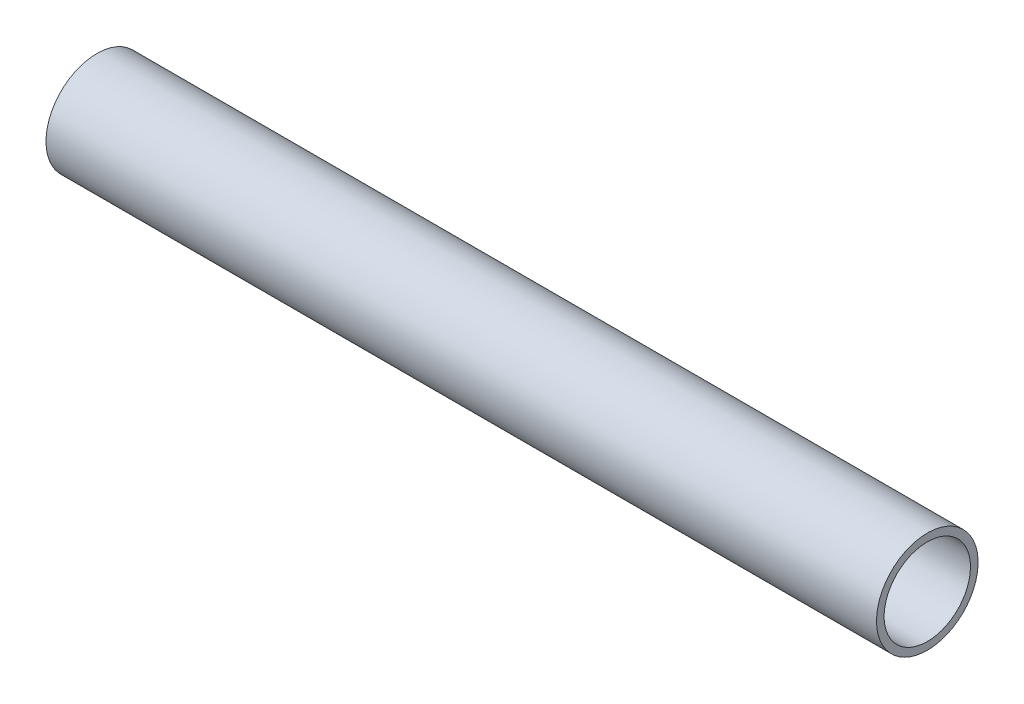
ISO-10303-21;
HEADER;
FILE_DESCRIPTION(('STEP AP214'),'2;1');
FILE_NAME('part.step','',(''),(''),'','','');
FILE_SCHEMA(('AUTOMOTIVE_DESIGN { 1 0 10303 214 1 1 1 1 }'));
ENDSEC;
DATA;
#1=APPLICATION_CONTEXT('core data for automotive mechanical design processes');
#2=APPLICATION_PROTOCOL_DEFINITION('international standard','automotive_design',2000,#1);
#3=PRODUCT_CONTEXT('',#1,'mechanical');
#4=PRODUCT('Part','Part','',(#3));
#5=PRODUCT_RELATED_PRODUCT_CATEGORY('part','',(#4));
#6=PRODUCT_DEFINITION_FORMATION('','',#4);
#7=PRODUCT_DEFINITION_CONTEXT('part definition',#1,'design');
#8=PRODUCT_DEFINITION('design','',#6,#7);
#9=PRODUCT_DEFINITION_SHAPE('','',#8);
#10=(LENGTH_UNIT() NAMED_UNIT(*) SI_UNIT(.MILLI.,.METRE.));
#11=(NAMED_UNIT(*) PLANE_ANGLE_UNIT() SI_UNIT($,.RADIAN.));
#12=(NAMED_UNIT(*) SI_UNIT($,.STERADIAN.) SOLID_ANGLE_UNIT());
#13=UNCERTAINTY_MEASURE_WITH_UNIT(LENGTH_MEASURE(1.E-05),#10,'distance_accuracy_value','');
#14=(GEOMETRIC_REPRESENTATION_CONTEXT(3) GLOBAL_UNCERTAINTY_ASSIGNED_CONTEXT((#13)) GLOBAL_UNIT_ASSIGNED_CONTEXT((#10,
#11,#12)) REPRESENTATION_CONTEXT('',''));
#15=CARTESIAN_POINT('',(0.,0.,0.));
#16=DIRECTION('',(0.,0.,1.));
#17=DIRECTION('',(1.,0.,0.));
#18=AXIS2_PLACEMENT_3D('',#15,#16,#17);
#19=CARTESIAN_POINT('',(327.,0.,0.));
#20=DIRECTION('',(-1.,0.,0.));
#21=DIRECTION('',(0.,0.,1.));
#22=AXIS2_PLACEMENT_3D('',#19,#20,#21);
#23=PLANE('',#22);
#24=CARTESIAN_POINT('',(327.,0.,0.));
#25=DIRECTION('',(1.,0.,0.));
#26=DIRECTION('',(0.,0.,-1.));
#27=AXIS2_PLACEMENT_3D('',#24,#25,#26);
#28=CIRCLE('',#27,17.);
#29=CARTESIAN_POINT('',(327.,0.,-17.));
#30=VERTEX_POINT('',#29);
#31=EDGE_CURVE('E61',#30,#30,#28,.T.);
#32=ORIENTED_EDGE('',*,*,#31,.F.);
#33=EDGE_LOOP('',(#32));
#34=FACE_BOUND('',#33,.T.);
#35=CARTESIAN_POINT('',(327.,0.,0.));
#36=DIRECTION('',(-1.,0.,0.));
#37=DIRECTION('',(0.,0.,1.));
#38=AXIS2_PLACEMENT_3D('',#35,#36,#37);
#39=CIRCLE('',#38,20.);
#40=CARTESIAN_POINT('',(327.,0.,20.));
#41=VERTEX_POINT('',#40);
#42=EDGE_CURVE('E67',#41,#41,#39,.F.);
#43=ORIENTED_EDGE('',*,*,#42,.T.);
#44=EDGE_LOOP('',(#43));
#45=FACE_BOUND('',#44,.T.);
#46=ADVANCED_FACE('F53',(#34,#45),#23,.F.);
#47=CARTESIAN_POINT('',(0.,0.,0.));
#48=DIRECTION('',(-1.,0.,0.));
#49=DIRECTION('',(0.,0.,1.));
#50=AXIS2_PLACEMENT_3D('',#47,#48,#49);
#51=PLANE('',#50);
#52=CARTESIAN_POINT('',(0.,0.,0.));
#53=DIRECTION('',(1.,0.,0.));
#54=DIRECTION('',(0.,0.,-1.));
#55=AXIS2_PLACEMENT_3D('',#52,#53,#54);
#56=CIRCLE('',#55,17.);
#57=CARTESIAN_POINT('',(0.,0.,-17.));
#58=VERTEX_POINT('',#57);
#59=EDGE_CURVE('E11',#58,#58,#56,.T.);
#60=ORIENTED_EDGE('',*,*,#59,.T.);
#61=EDGE_LOOP('',(#60));
#62=FACE_BOUND('',#61,.T.);
#63=CARTESIAN_POINT('',(0.,0.,0.));
#64=DIRECTION('',(-1.,0.,0.));
#65=DIRECTION('',(0.,0.,1.));
#66=AXIS2_PLACEMENT_3D('',#63,#64,#65);
#67=CIRCLE('',#66,20.);
#68=CARTESIAN_POINT('',(0.,0.,20.));
#69=VERTEX_POINT('',#68);
#70=EDGE_CURVE('E57',#69,#69,#67,.F.);
#71=ORIENTED_EDGE('',*,*,#70,.F.);
#72=EDGE_LOOP('',(#71));
#73=FACE_BOUND('',#72,.T.);
#74=ADVANCED_FACE('F55',(#62,#73),#51,.T.);
#75=CARTESIAN_POINT('',(327.,0.,0.));
#76=DIRECTION('',(-1.,0.,0.));
#77=DIRECTION('',(0.,0.,1.));
#78=AXIS2_PLACEMENT_3D('',#75,#76,#77);
#79=CYLINDRICAL_SURFACE('',#78,17.);
#80=ORIENTED_EDGE('',*,*,#31,.T.);
#81=EDGE_LOOP('',(#80));
#82=FACE_BOUND('',#81,.T.);
#83=ORIENTED_EDGE('',*,*,#59,.F.);
#84=EDGE_LOOP('',(#83));
#85=FACE_BOUND('',#84,.T.);
#86=ADVANCED_FACE('F77',(#82,#85),#79,.F.);
#87=CARTESIAN_POINT('',(327.,0.,0.));
#88=DIRECTION('',(-1.,0.,0.));
#89=DIRECTION('',(0.,0.,1.));
#90=AXIS2_PLACEMENT_3D('',#87,#88,#89);
#91=CYLINDRICAL_SURFACE('',#90,20.);
#92=ORIENTED_EDGE('',*,*,#42,.F.);
#93=EDGE_LOOP('',(#92));
#94=FACE_BOUND('',#93,.T.);
#95=ORIENTED_EDGE('',*,*,#70,.T.);
#96=EDGE_LOOP('',(#95));
#97=FACE_BOUND('',#96,.T.);
#98=ADVANCED_FACE('F74',(#94,#97),#91,.T.);
#99=CLOSED_SHELL('',(#46,#74,#86,#98));
#100=MANIFOLD_SOLID_BREP('B2',#99);
#101=ADVANCED_BREP_SHAPE_REPRESENTATION('',(#18,#100),#14);
#102=SHAPE_DEFINITION_REPRESENTATION(#9,#101);
ENDSEC;
END-ISO-10303-21;
